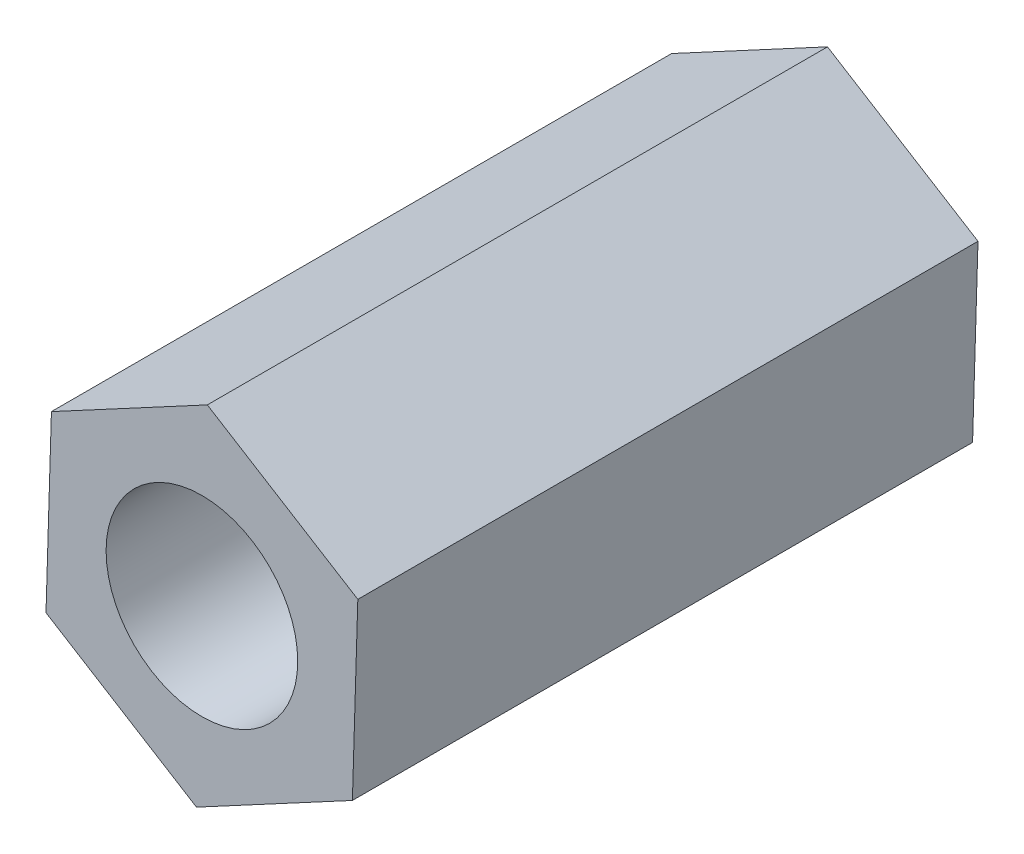
ISO-10303-21;
HEADER;
FILE_DESCRIPTION(('STEP AP214'),'2;1');
FILE_NAME('part.step','',(''),(''),'','','');
FILE_SCHEMA(('AUTOMOTIVE_DESIGN { 1 0 10303 214 1 1 1 1 }'));
ENDSEC;
DATA;
#1=APPLICATION_CONTEXT('core data for automotive mechanical design processes');
#2=APPLICATION_PROTOCOL_DEFINITION('international standard','automotive_design',2000,#1);
#3=PRODUCT_CONTEXT('',#1,'mechanical');
#4=PRODUCT('Part','Part','',(#3));
#5=PRODUCT_RELATED_PRODUCT_CATEGORY('part','',(#4));
#6=PRODUCT_DEFINITION_FORMATION('','',#4);
#7=PRODUCT_DEFINITION_CONTEXT('part definition',#1,'design');
#8=PRODUCT_DEFINITION('design','',#6,#7);
#9=PRODUCT_DEFINITION_SHAPE('','',#8);
#10=(LENGTH_UNIT() NAMED_UNIT(*) SI_UNIT(.MILLI.,.METRE.));
#11=(NAMED_UNIT(*) PLANE_ANGLE_UNIT() SI_UNIT($,.RADIAN.));
#12=(NAMED_UNIT(*) SI_UNIT($,.STERADIAN.) SOLID_ANGLE_UNIT());
#13=UNCERTAINTY_MEASURE_WITH_UNIT(LENGTH_MEASURE(1.E-05),#10,'distance_accuracy_value','');
#14=(GEOMETRIC_REPRESENTATION_CONTEXT(3) GLOBAL_UNCERTAINTY_ASSIGNED_CONTEXT((#13)) GLOBAL_UNIT_ASSIGNED_CONTEXT((#10,
#11,#12)) REPRESENTATION_CONTEXT('',''));
#15=CARTESIAN_POINT('',(0.,0.,0.));
#16=DIRECTION('',(0.,0.,1.));
#17=DIRECTION('',(1.,0.,0.));
#18=AXIS2_PLACEMENT_3D('',#15,#16,#17);
#19=CARTESIAN_POINT('',(-18.5301130390924,-0.269450567108481,-12.1));
#20=DIRECTION('',(0.999530911619697,-0.0306260790291301,0.));
#21=DIRECTION('',(0.,0.,-1.));
#22=AXIS2_PLACEMENT_3D('',#19,#20,#21);
#23=PLANE('',#22);
#24=DIRECTION('',(0.,0.,1.));
#25=VECTOR('',#24,1.);
#26=CARTESIAN_POINT('',(-18.6856803965458,-5.34663927499835,-12.1));
#27=LINE('',#26,#25);
#28=CARTESIAN_POINT('',(-18.6856803965458,-5.34663927499835,3.));
#29=VERTEX_POINT('',#28);
#30=CARTESIAN_POINT('',(-18.6856803965458,-5.34663927499835,38.6));
#31=VERTEX_POINT('',#30);
#32=EDGE_CURVE('E102',#29,#31,#27,.T.);
#33=ORIENTED_EDGE('',*,*,#32,.F.);
#34=DIRECTION('',(0.0306260790291301,0.999530911619697,0.));
#35=VECTOR('',#34,1.);
#36=CARTESIAN_POINT('',(-18.9043721472287,-12.4839931855626,3.));
#37=LINE('',#36,#35);
#38=CARTESIAN_POINT('',(-18.374545681639,4.80773814078139,3.));
#39=VERTEX_POINT('',#38);
#40=EDGE_CURVE('E98',#29,#39,#37,.T.);
#41=ORIENTED_EDGE('',*,*,#40,.T.);
#42=DIRECTION('',(0.,0.,1.));
#43=VECTOR('',#42,1.);
#44=CARTESIAN_POINT('',(-18.374545681639,4.80773814078139,-12.1));
#45=LINE('',#44,#43);
#46=CARTESIAN_POINT('',(-18.374545681639,4.80773814078139,38.6));
#47=VERTEX_POINT('',#46);
#48=EDGE_CURVE('E27',#39,#47,#45,.T.);
#49=ORIENTED_EDGE('',*,*,#48,.T.);
#50=DIRECTION('',(0.0306260790291301,0.999530911619697,0.));
#51=VECTOR('',#50,1.);
#52=CARTESIAN_POINT('',(-18.9043721472287,-12.4839931855626,38.6));
#53=LINE('',#52,#51);
#54=EDGE_CURVE('E114',#31,#47,#53,.T.);
#55=ORIENTED_EDGE('',*,*,#54,.F.);
#56=EDGE_LOOP('',(#33,#41,#49,#55));
#57=FACE_BOUND('',#56,.T.);
#58=ADVANCED_FACE('F17',(#57),#23,.T.);
#59=CARTESIAN_POINT('',(-31.9543872777929,-7.48105777828057,-12.1));
#60=DIRECTION('',(-0.526288418267385,-0.850306121815911,0.));
#61=DIRECTION('',(-0.850306121815911,0.526288418267385,0.));
#62=AXIS2_PLACEMENT_3D('',#59,#60,#61);
#63=PLANE('',#62);
#64=DIRECTION('',(0.,0.,1.));
#65=VECTOR('',#64,1.);
#66=CARTESIAN_POINT('',(-36.2735779999062,-4.8077381407814,-12.1));
#67=LINE('',#66,#65);
#68=CARTESIAN_POINT('',(-36.2735779999062,-4.8077381407814,3.));
#69=VERTEX_POINT('',#68);
#70=CARTESIAN_POINT('',(-36.2735779999062,-4.8077381407814,38.6));
#71=VERTEX_POINT('',#70);
#72=EDGE_CURVE('E66',#69,#71,#67,.T.);
#73=ORIENTED_EDGE('',*,*,#72,.F.);
#74=DIRECTION('',(0.850306121815911,-0.526288418267385,0.));
#75=VECTOR('',#74,1.);
#76=CARTESIAN_POINT('',(-52.8620622664934,5.45953728171124,3.));
#77=LINE('',#76,#75);
#78=CARTESIAN_POINT('',(-27.6351965556794,-10.1543774157797,3.));
#79=VERTEX_POINT('',#78);
#80=EDGE_CURVE('E69',#69,#79,#77,.T.);
#81=ORIENTED_EDGE('',*,*,#80,.T.);
#82=DIRECTION('',(0.,0.,1.));
#83=VECTOR('',#82,1.);
#84=CARTESIAN_POINT('',(-27.6351965556794,-10.1543774157797,-12.1));
#85=LINE('',#84,#83);
#86=CARTESIAN_POINT('',(-27.6351965556794,-10.1543774157797,38.6));
#87=VERTEX_POINT('',#86);
#88=EDGE_CURVE('E57',#79,#87,#85,.T.);
#89=ORIENTED_EDGE('',*,*,#88,.T.);
#90=DIRECTION('',(0.850306121815911,-0.526288418267385,0.));
#91=VECTOR('',#90,1.);
#92=CARTESIAN_POINT('',(-52.8620622664934,5.45953728171124,38.6));
#93=LINE('',#92,#91);
#94=EDGE_CURVE('E73',#71,#87,#93,.T.);
#95=ORIENTED_EDGE('',*,*,#94,.F.);
#96=EDGE_LOOP('',(#73,#81,#89,#95));
#97=FACE_BOUND('',#96,.T.);
#98=ADVANCED_FACE('F19',(#97),#63,.T.);
#99=CARTESIAN_POINT('',(-31.4876852054327,7.75050834538906,-12.1));
#100=DIRECTION('',(-0.473242493352312,0.880932200845041,0.));
#101=DIRECTION('',(0.,0.,1.));
#102=AXIS2_PLACEMENT_3D('',#99,#100,#101);
#103=PLANE('',#102);
#104=DIRECTION('',(0.,0.,1.));
#105=VECTOR('',#104,1.);
#106=CARTESIAN_POINT('',(-27.0129271258659,10.1543774157797,-12.1));
#107=LINE('',#106,#105);
#108=CARTESIAN_POINT('',(-27.0129271258659,10.1543774157797,3.));
#109=VERTEX_POINT('',#108);
#110=CARTESIAN_POINT('',(-27.0129271258659,10.1543774157797,38.6));
#111=VERTEX_POINT('',#110);
#112=EDGE_CURVE('E11',#109,#111,#107,.T.);
#113=ORIENTED_EDGE('',*,*,#112,.F.);
#114=DIRECTION('',(-0.880932200845041,-0.473242493352312,0.));
#115=VECTOR('',#114,1.);
#116=CARTESIAN_POINT('',(-63.9136405190804,-9.66892521288155,3.));
#117=LINE('',#116,#115);
#118=CARTESIAN_POINT('',(-35.9624432849995,5.34663927499836,3.));
#119=VERTEX_POINT('',#118);
#120=EDGE_CURVE('E87',#109,#119,#117,.T.);
#121=ORIENTED_EDGE('',*,*,#120,.T.);
#122=DIRECTION('',(0.,0.,1.));
#123=VECTOR('',#122,1.);
#124=CARTESIAN_POINT('',(-35.9624432849995,5.34663927499836,-12.1));
#125=LINE('',#124,#123);
#126=CARTESIAN_POINT('',(-35.9624432849995,5.34663927499836,38.6));
#127=VERTEX_POINT('',#126);
#128=EDGE_CURVE('E78',#119,#127,#125,.T.);
#129=ORIENTED_EDGE('',*,*,#128,.T.);
#130=DIRECTION('',(-0.880932200845041,-0.473242493352312,0.));
#131=VECTOR('',#130,1.);
#132=CARTESIAN_POINT('',(-63.9136405190804,-9.66892521288155,38.6));
#133=LINE('',#132,#131);
#134=EDGE_CURVE('E127',#111,#127,#133,.T.);
#135=ORIENTED_EDGE('',*,*,#134,.F.);
#136=EDGE_LOOP('',(#113,#121,#129,#135));
#137=FACE_BOUND('',#136,.T.);
#138=ADVANCED_FACE('F196',(#137),#103,.T.);
#139=CARTESIAN_POINT('',(-22.6937364037525,7.48105777828058,-12.1));
#140=DIRECTION('',(0.526288418267385,0.850306121815911,0.));
#141=DIRECTION('',(0.,0.,-1.));
#142=AXIS2_PLACEMENT_3D('',#139,#140,#141);
#143=PLANE('',#142);
#144=ORIENTED_EDGE('',*,*,#48,.F.);
#145=DIRECTION('',(-0.850306121815911,0.526288418267385,0.));
#146=VECTOR('',#145,1.);
#147=CARTESIAN_POINT('',(-43.601411392453,20.4216528382724,3.));
#148=LINE('',#147,#146);
#149=EDGE_CURVE('E144',#39,#109,#148,.T.);
#150=ORIENTED_EDGE('',*,*,#149,.T.);
#151=ORIENTED_EDGE('',*,*,#112,.T.);
#152=DIRECTION('',(-0.850306121815911,0.526288418267385,0.));
#153=VECTOR('',#152,1.);
#154=CARTESIAN_POINT('',(-43.601411392453,20.4216528382724,38.6));
#155=LINE('',#154,#153);
#156=EDGE_CURVE('E122',#47,#111,#155,.T.);
#157=ORIENTED_EDGE('',*,*,#156,.F.);
#158=EDGE_LOOP('',(#144,#150,#151,#157));
#159=FACE_BOUND('',#158,.T.);
#160=ADVANCED_FACE('F123',(#159),#143,.T.);
#161=CARTESIAN_POINT('',(-36.1180106424529,0.269450567108484,-12.1));
#162=DIRECTION('',(-0.999530911619697,0.0306260790291308,0.));
#163=DIRECTION('',(0.,0.,1.));
#164=AXIS2_PLACEMENT_3D('',#161,#162,#163);
#165=PLANE('',#164);
#166=ORIENTED_EDGE('',*,*,#128,.F.);
#167=DIRECTION('',(-0.0306260790291308,-0.999530911619697,0.));
#168=VECTOR('',#167,1.);
#169=CARTESIAN_POINT('',(-36.4922697505892,-11.9450920513457,3.));
#170=LINE('',#169,#168);
#171=EDGE_CURVE('E81',#119,#69,#170,.T.);
#172=ORIENTED_EDGE('',*,*,#171,.T.);
#173=ORIENTED_EDGE('',*,*,#72,.T.);
#174=DIRECTION('',(-0.0306260790291308,-0.999530911619697,0.));
#175=VECTOR('',#174,1.);
#176=CARTESIAN_POINT('',(-36.4922697505892,-11.9450920513457,38.6));
#177=LINE('',#176,#175);
#178=EDGE_CURVE('E154',#127,#71,#177,.T.);
#179=ORIENTED_EDGE('',*,*,#178,.F.);
#180=EDGE_LOOP('',(#166,#172,#173,#179));
#181=FACE_BOUND('',#180,.T.);
#182=ADVANCED_FACE('F82',(#181),#165,.T.);
#183=CARTESIAN_POINT('',(-23.1604384761126,-7.75050834538906,-12.1));
#184=DIRECTION('',(0.473242493352311,-0.880932200845041,0.));
#185=DIRECTION('',(0.,0.,-1.));
#186=AXIS2_PLACEMENT_3D('',#183,#184,#185);
#187=PLANE('',#186);
#188=ORIENTED_EDGE('',*,*,#88,.F.);
#189=DIRECTION('',(0.880932200845041,0.473242493352311,0.));
#190=VECTOR('',#189,1.);
#191=CARTESIAN_POINT('',(-55.5863937897603,-25.1699419036596,3.));
#192=LINE('',#191,#190);
#193=EDGE_CURVE('E92',#79,#29,#192,.T.);
#194=ORIENTED_EDGE('',*,*,#193,.T.);
#195=ORIENTED_EDGE('',*,*,#32,.T.);
#196=DIRECTION('',(0.880932200845041,0.473242493352311,0.));
#197=VECTOR('',#196,1.);
#198=CARTESIAN_POINT('',(-55.5863937897603,-25.1699419036596,38.6));
#199=LINE('',#198,#197);
#200=EDGE_CURVE('E131',#87,#31,#199,.T.);
#201=ORIENTED_EDGE('',*,*,#200,.F.);
#202=EDGE_LOOP('',(#188,#194,#195,#201));
#203=FACE_BOUND('',#202,.T.);
#204=ADVANCED_FACE('F175',(#203),#187,.T.);
#205=CARTESIAN_POINT('',(-27.3240618407726,0.,38.6));
#206=DIRECTION('',(0.,0.,-1.));
#207=DIRECTION('',(-1.,0.,0.));
#208=AXIS2_PLACEMENT_3D('',#205,#206,#207);
#209=CYLINDRICAL_SURFACE('',#208,5.5);
#210=CARTESIAN_POINT('',(-27.3240618407726,0.,3.));
#211=DIRECTION('',(0.,0.,1.));
#212=DIRECTION('',(1.,0.,0.));
#213=AXIS2_PLACEMENT_3D('',#210,#211,#212);
#214=CIRCLE('',#213,5.5);
#215=CARTESIAN_POINT('',(-21.8240618407726,0.,3.));
#216=VERTEX_POINT('',#215);
#217=EDGE_CURVE('E141',#216,#216,#214,.T.);
#218=ORIENTED_EDGE('',*,*,#217,.F.);
#219=EDGE_LOOP('',(#218));
#220=FACE_BOUND('',#219,.T.);
#221=CARTESIAN_POINT('',(-27.3240618407726,0.,38.6));
#222=DIRECTION('',(0.,0.,1.));
#223=DIRECTION('',(1.,0.,0.));
#224=AXIS2_PLACEMENT_3D('',#221,#222,#223);
#225=CIRCLE('',#224,5.5);
#226=CARTESIAN_POINT('',(-21.8240618407726,0.,38.6));
#227=VERTEX_POINT('',#226);
#228=EDGE_CURVE('E137',#227,#227,#225,.T.);
#229=ORIENTED_EDGE('',*,*,#228,.T.);
#230=EDGE_LOOP('',(#229));
#231=FACE_BOUND('',#230,.T.);
#232=ADVANCED_FACE('F228',(#220,#231),#209,.F.);
#233=CARTESIAN_POINT('',(-63.1293214477623,-11.1289207444886,3.));
#234=DIRECTION('',(0.,0.,1.));
#235=DIRECTION('',(1.,0.,0.));
#236=AXIS2_PLACEMENT_3D('',#233,#234,#235);
#237=PLANE('',#236);
#238=ORIENTED_EDGE('',*,*,#40,.F.);
#239=ORIENTED_EDGE('',*,*,#193,.F.);
#240=ORIENTED_EDGE('',*,*,#80,.F.);
#241=ORIENTED_EDGE('',*,*,#171,.F.);
#242=ORIENTED_EDGE('',*,*,#120,.F.);
#243=ORIENTED_EDGE('',*,*,#149,.F.);
#244=EDGE_LOOP('',(#238,#239,#240,#241,#242,#243));
#245=FACE_BOUND('',#244,.T.);
#246=ORIENTED_EDGE('',*,*,#217,.T.);
#247=EDGE_LOOP('',(#246));
#248=FACE_BOUND('',#247,.T.);
#249=ADVANCED_FACE('F90',(#245,#248),#237,.F.);
#250=CARTESIAN_POINT('',(-63.1293214477623,-11.1289207444886,38.6));
#251=DIRECTION('',(0.,0.,1.));
#252=DIRECTION('',(1.,0.,0.));
#253=AXIS2_PLACEMENT_3D('',#250,#251,#252);
#254=PLANE('',#253);
#255=ORIENTED_EDGE('',*,*,#200,.T.);
#256=ORIENTED_EDGE('',*,*,#54,.T.);
#257=ORIENTED_EDGE('',*,*,#156,.T.);
#258=ORIENTED_EDGE('',*,*,#134,.T.);
#259=ORIENTED_EDGE('',*,*,#178,.T.);
#260=ORIENTED_EDGE('',*,*,#94,.T.);
#261=EDGE_LOOP('',(#255,#256,#257,#258,#259,#260));
#262=FACE_BOUND('',#261,.T.);
#263=ORIENTED_EDGE('',*,*,#228,.F.);
#264=EDGE_LOOP('',(#263));
#265=FACE_BOUND('',#264,.T.);
#266=ADVANCED_FACE('F129',(#262,#265),#254,.T.);
#267=CLOSED_SHELL('',(#58,#98,#138,#160,#182,#204,#232,#249,#266));
#268=MANIFOLD_SOLID_BREP('B1',#267);
#269=ADVANCED_BREP_SHAPE_REPRESENTATION('',(#18,#268),#14);
#270=SHAPE_DEFINITION_REPRESENTATION(#9,#269);
ENDSEC;
END-ISO-10303-21;
